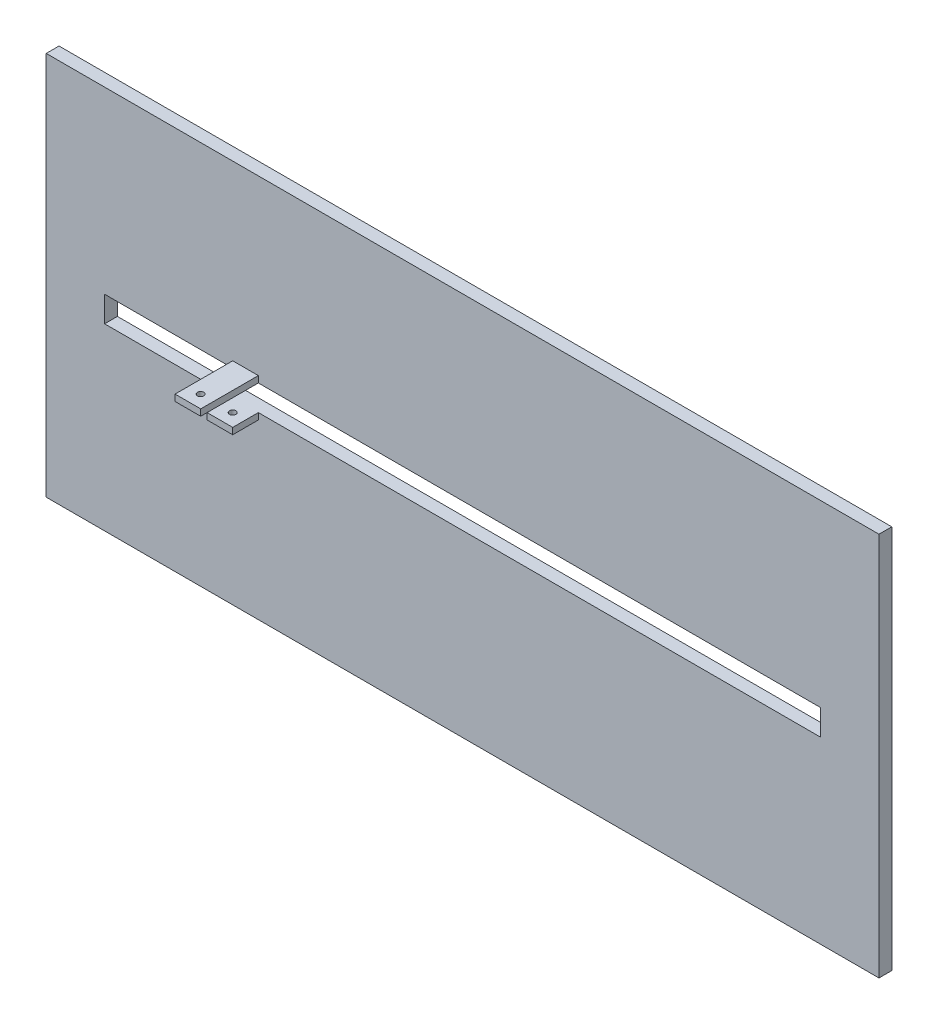
ISO-10303-21;
HEADER;
FILE_DESCRIPTION(('STEP AP214'),'2;1');
FILE_NAME('part.step','',(''),(''),'','','');
FILE_SCHEMA(('AUTOMOTIVE_DESIGN { 1 0 10303 214 1 1 1 1 }'));
ENDSEC;
DATA;
#1=APPLICATION_CONTEXT('core data for automotive mechanical design processes');
#2=APPLICATION_PROTOCOL_DEFINITION('international standard','automotive_design',2000,#1);
#3=PRODUCT_CONTEXT('',#1,'mechanical');
#4=PRODUCT('Part','Part','',(#3));
#5=PRODUCT_RELATED_PRODUCT_CATEGORY('part','',(#4));
#6=PRODUCT_DEFINITION_FORMATION('','',#4);
#7=PRODUCT_DEFINITION_CONTEXT('part definition',#1,'design');
#8=PRODUCT_DEFINITION('design','',#6,#7);
#9=PRODUCT_DEFINITION_SHAPE('','',#8);
#10=(LENGTH_UNIT() NAMED_UNIT(*) SI_UNIT(.MILLI.,.METRE.));
#11=(NAMED_UNIT(*) PLANE_ANGLE_UNIT() SI_UNIT($,.RADIAN.));
#12=(NAMED_UNIT(*) SI_UNIT($,.STERADIAN.) SOLID_ANGLE_UNIT());
#13=UNCERTAINTY_MEASURE_WITH_UNIT(LENGTH_MEASURE(1.E-05),#10,'distance_accuracy_value','');
#14=(GEOMETRIC_REPRESENTATION_CONTEXT(3) GLOBAL_UNCERTAINTY_ASSIGNED_CONTEXT((#13)) GLOBAL_UNIT_ASSIGNED_CONTEXT((#10,
#11,#12)) REPRESENTATION_CONTEXT('',''));
#15=CARTESIAN_POINT('',(0.,0.,0.));
#16=DIRECTION('',(0.,0.,1.));
#17=DIRECTION('',(1.,0.,0.));
#18=AXIS2_PLACEMENT_3D('',#15,#16,#17);
#19=CARTESIAN_POINT('',(0.,0.,20.));
#20=DIRECTION('',(0.,0.,1.));
#21=DIRECTION('',(1.,0.,0.));
#22=AXIS2_PLACEMENT_3D('',#19,#20,#21);
#23=PLANE('',#22);
#24=DIRECTION('',(0.,1.,0.));
#25=VECTOR('',#24,1.);
#26=CARTESIAN_POINT('',(649.999999999999,300.,20.));
#27=LINE('',#26,#25);
#28=CARTESIAN_POINT('',(650.,-300.,20.));
#29=VERTEX_POINT('',#28);
#30=CARTESIAN_POINT('',(649.999999999999,300.,20.));
#31=VERTEX_POINT('',#30);
#32=EDGE_CURVE('E301',#29,#31,#27,.T.);
#33=ORIENTED_EDGE('',*,*,#32,.T.);
#34=DIRECTION('',(-1.,0.,0.));
#35=VECTOR('',#34,1.);
#36=CARTESIAN_POINT('',(-650.,300.,20.));
#37=LINE('',#36,#35);
#38=CARTESIAN_POINT('',(-650.,300.,20.));
#39=VERTEX_POINT('',#38);
#40=EDGE_CURVE('E305',#31,#39,#37,.T.);
#41=ORIENTED_EDGE('',*,*,#40,.T.);
#42=DIRECTION('',(0.,-1.,0.));
#43=VECTOR('',#42,1.);
#44=CARTESIAN_POINT('',(-650.,300.,20.));
#45=LINE('',#44,#43);
#46=CARTESIAN_POINT('',(-650.,-300.,20.));
#47=VERTEX_POINT('',#46);
#48=EDGE_CURVE('E309',#39,#47,#45,.T.);
#49=ORIENTED_EDGE('',*,*,#48,.T.);
#50=DIRECTION('',(1.,0.,0.));
#51=VECTOR('',#50,1.);
#52=CARTESIAN_POINT('',(-650.,-300.,20.));
#53=LINE('',#52,#51);
#54=EDGE_CURVE('E312',#47,#29,#53,.T.);
#55=ORIENTED_EDGE('',*,*,#54,.T.);
#56=EDGE_LOOP('',(#33,#41,#49,#55));
#57=FACE_BOUND('',#56,.T.);
#58=DIRECTION('',(1.,0.,0.));
#59=VECTOR('',#58,1.);
#60=CARTESIAN_POINT('',(-558.838186436975,-20.0000000000002,20.));
#61=LINE('',#60,#59);
#62=CARTESIAN_POINT('',(-318.838186436974,-20.0000000000002,20.));
#63=VERTEX_POINT('',#62);
#64=CARTESIAN_POINT('',(558.838186436974,-20.0000000000002,20.));
#65=VERTEX_POINT('',#64);
#66=EDGE_CURVE('E258',#63,#65,#61,.T.);
#67=ORIENTED_EDGE('',*,*,#66,.F.);
#68=DIRECTION('',(0.,1.,0.));
#69=VECTOR('',#68,1.);
#70=CARTESIAN_POINT('',(-318.838186436974,-29.9999999999989,20.));
#71=LINE('',#70,#69);
#72=CARTESIAN_POINT('',(-318.838186436974,-29.9999999999989,20.));
#73=VERTEX_POINT('',#72);
#74=EDGE_CURVE('E221',#73,#63,#71,.T.);
#75=ORIENTED_EDGE('',*,*,#74,.F.);
#76=DIRECTION('',(1.,0.,0.));
#77=VECTOR('',#76,1.);
#78=CARTESIAN_POINT('',(-358.838186436974,-29.9999999999992,20.));
#79=LINE('',#78,#77);
#80=CARTESIAN_POINT('',(-358.838186436974,-29.9999999999992,20.));
#81=VERTEX_POINT('',#80);
#82=EDGE_CURVE('E199',#81,#73,#79,.T.);
#83=ORIENTED_EDGE('',*,*,#82,.F.);
#84=DIRECTION('',(0.,-1.,0.));
#85=VECTOR('',#84,1.);
#86=CARTESIAN_POINT('',(-358.838186436974,-19.9999999999992,20.));
#87=LINE('',#86,#85);
#88=CARTESIAN_POINT('',(-358.838186436974,-19.9999999999992,20.));
#89=VERTEX_POINT('',#88);
#90=EDGE_CURVE('E208',#89,#81,#87,.T.);
#91=ORIENTED_EDGE('',*,*,#90,.F.);
#92=CARTESIAN_POINT('',(-558.838186436975,-20.0000000000002,20.));
#93=VERTEX_POINT('',#92);
#94=EDGE_CURVE('E260',#93,#89,#61,.T.);
#95=ORIENTED_EDGE('',*,*,#94,.F.);
#96=DIRECTION('',(0.,-1.,0.));
#97=VECTOR('',#96,1.);
#98=CARTESIAN_POINT('',(-558.838186436975,20.,20.));
#99=LINE('',#98,#97);
#100=CARTESIAN_POINT('',(-558.838186436975,20.,20.));
#101=VERTEX_POINT('',#100);
#102=EDGE_CURVE('E255',#101,#93,#99,.T.);
#103=ORIENTED_EDGE('',*,*,#102,.F.);
#104=DIRECTION('',(-1.,0.,0.));
#105=VECTOR('',#104,1.);
#106=CARTESIAN_POINT('',(558.838186436974,20.,20.));
#107=LINE('',#106,#105);
#108=CARTESIAN_POINT('',(-358.838186436975,20.,20.));
#109=VERTEX_POINT('',#108);
#110=EDGE_CURVE('E268',#109,#101,#107,.T.);
#111=ORIENTED_EDGE('',*,*,#110,.F.);
#112=DIRECTION('',(0.,-1.,0.));
#113=VECTOR('',#112,1.);
#114=CARTESIAN_POINT('',(-358.838186436974,20.,20.));
#115=LINE('',#114,#113);
#116=CARTESIAN_POINT('',(-358.838186436974,30.,20.));
#117=VERTEX_POINT('',#116);
#118=EDGE_CURVE('E63',#117,#109,#115,.T.);
#119=ORIENTED_EDGE('',*,*,#118,.F.);
#120=DIRECTION('',(-1.,0.,0.));
#121=VECTOR('',#120,1.);
#122=CARTESIAN_POINT('',(-358.838186436974,30.,20.));
#123=LINE('',#122,#121);
#124=CARTESIAN_POINT('',(-318.838186436974,30.,20.));
#125=VERTEX_POINT('',#124);
#126=EDGE_CURVE('E241',#125,#117,#123,.T.);
#127=ORIENTED_EDGE('',*,*,#126,.F.);
#128=DIRECTION('',(0.,1.,0.));
#129=VECTOR('',#128,1.);
#130=CARTESIAN_POINT('',(-318.838186436974,30.,20.));
#131=LINE('',#130,#129);
#132=CARTESIAN_POINT('',(-318.838186436974,20.,20.));
#133=VERTEX_POINT('',#132);
#134=EDGE_CURVE('E237',#133,#125,#131,.T.);
#135=ORIENTED_EDGE('',*,*,#134,.F.);
#136=CARTESIAN_POINT('',(558.838186436974,20.,20.));
#137=VERTEX_POINT('',#136);
#138=EDGE_CURVE('E269',#137,#133,#107,.T.);
#139=ORIENTED_EDGE('',*,*,#138,.F.);
#140=DIRECTION('',(0.,1.,0.));
#141=VECTOR('',#140,1.);
#142=CARTESIAN_POINT('',(558.838186436974,20.,20.));
#143=LINE('',#142,#141);
#144=EDGE_CURVE('E264',#65,#137,#143,.T.);
#145=ORIENTED_EDGE('',*,*,#144,.F.);
#146=EDGE_LOOP('',(#67,#75,#83,#91,#95,#103,#111,#119,#127,#135,#139,#145));
#147=FACE_BOUND('',#146,.T.);
#148=ADVANCED_FACE('F39',(#57,#147),#23,.T.);
#149=CARTESIAN_POINT('',(0.,0.,0.));
#150=DIRECTION('',(0.,0.,1.));
#151=DIRECTION('',(1.,0.,0.));
#152=AXIS2_PLACEMENT_3D('',#149,#150,#151);
#153=PLANE('',#152);
#154=DIRECTION('',(0.,1.,0.));
#155=VECTOR('',#154,1.);
#156=CARTESIAN_POINT('',(649.999999999999,300.,0.));
#157=LINE('',#156,#155);
#158=CARTESIAN_POINT('',(650.,-300.,0.));
#159=VERTEX_POINT('',#158);
#160=CARTESIAN_POINT('',(649.999999999999,300.,0.));
#161=VERTEX_POINT('',#160);
#162=EDGE_CURVE('E300',#159,#161,#157,.T.);
#163=ORIENTED_EDGE('',*,*,#162,.F.);
#164=DIRECTION('',(1.,0.,0.));
#165=VECTOR('',#164,1.);
#166=CARTESIAN_POINT('',(-650.,-300.,0.));
#167=LINE('',#166,#165);
#168=CARTESIAN_POINT('',(-650.,-300.,0.));
#169=VERTEX_POINT('',#168);
#170=EDGE_CURVE('E306',#169,#159,#167,.T.);
#171=ORIENTED_EDGE('',*,*,#170,.F.);
#172=DIRECTION('',(0.,-1.,0.));
#173=VECTOR('',#172,1.);
#174=CARTESIAN_POINT('',(-650.,300.,0.));
#175=LINE('',#174,#173);
#176=CARTESIAN_POINT('',(-650.,300.,0.));
#177=VERTEX_POINT('',#176);
#178=EDGE_CURVE('E322',#177,#169,#175,.T.);
#179=ORIENTED_EDGE('',*,*,#178,.F.);
#180=DIRECTION('',(-1.,0.,0.));
#181=VECTOR('',#180,1.);
#182=CARTESIAN_POINT('',(-650.,300.,0.));
#183=LINE('',#182,#181);
#184=EDGE_CURVE('E319',#161,#177,#183,.T.);
#185=ORIENTED_EDGE('',*,*,#184,.F.);
#186=EDGE_LOOP('',(#163,#171,#179,#185));
#187=FACE_BOUND('',#186,.T.);
#188=DIRECTION('',(0.,-1.,0.));
#189=VECTOR('',#188,1.);
#190=CARTESIAN_POINT('',(-558.838186436975,20.,0.));
#191=LINE('',#190,#189);
#192=CARTESIAN_POINT('',(-558.838186436975,20.,0.));
#193=VERTEX_POINT('',#192);
#194=CARTESIAN_POINT('',(-558.838186436975,-20.0000000000002,0.));
#195=VERTEX_POINT('',#194);
#196=EDGE_CURVE('E254',#193,#195,#191,.T.);
#197=ORIENTED_EDGE('',*,*,#196,.T.);
#198=DIRECTION('',(1.,0.,0.));
#199=VECTOR('',#198,1.);
#200=CARTESIAN_POINT('',(-558.838186436975,-20.0000000000002,0.));
#201=LINE('',#200,#199);
#202=CARTESIAN_POINT('',(558.838186436974,-20.0000000000002,0.));
#203=VERTEX_POINT('',#202);
#204=EDGE_CURVE('E276',#195,#203,#201,.T.);
#205=ORIENTED_EDGE('',*,*,#204,.T.);
#206=DIRECTION('',(0.,1.,0.));
#207=VECTOR('',#206,1.);
#208=CARTESIAN_POINT('',(558.838186436974,20.,0.));
#209=LINE('',#208,#207);
#210=CARTESIAN_POINT('',(558.838186436974,20.,0.));
#211=VERTEX_POINT('',#210);
#212=EDGE_CURVE('E280',#203,#211,#209,.T.);
#213=ORIENTED_EDGE('',*,*,#212,.T.);
#214=DIRECTION('',(-1.,0.,0.));
#215=VECTOR('',#214,1.);
#216=CARTESIAN_POINT('',(558.838186436974,20.,0.));
#217=LINE('',#216,#215);
#218=EDGE_CURVE('E259',#211,#193,#217,.T.);
#219=ORIENTED_EDGE('',*,*,#218,.T.);
#220=EDGE_LOOP('',(#197,#205,#213,#219));
#221=FACE_BOUND('',#220,.T.);
#222=ADVANCED_FACE('F345',(#187,#221),#153,.F.);
#223=CARTESIAN_POINT('',(649.999999999999,300.,20.));
#224=DIRECTION('',(-1.,0.,0.));
#225=DIRECTION('',(0.,-1.,0.));
#226=AXIS2_PLACEMENT_3D('',#223,#224,#225);
#227=PLANE('',#226);
#228=ORIENTED_EDGE('',*,*,#162,.T.);
#229=DIRECTION('',(0.,0.,-1.));
#230=VECTOR('',#229,1.);
#231=CARTESIAN_POINT('',(649.999999999999,300.,20.));
#232=LINE('',#231,#230);
#233=EDGE_CURVE('E11',#31,#161,#232,.T.);
#234=ORIENTED_EDGE('',*,*,#233,.F.);
#235=ORIENTED_EDGE('',*,*,#32,.F.);
#236=DIRECTION('',(0.,0.,-1.));
#237=VECTOR('',#236,1.);
#238=CARTESIAN_POINT('',(650.,-300.,20.));
#239=LINE('',#238,#237);
#240=EDGE_CURVE('E315',#29,#159,#239,.T.);
#241=ORIENTED_EDGE('',*,*,#240,.T.);
#242=EDGE_LOOP('',(#228,#234,#235,#241));
#243=FACE_BOUND('',#242,.T.);
#244=ADVANCED_FACE('F41',(#243),#227,.F.);
#245=CARTESIAN_POINT('',(-650.,300.,20.));
#246=DIRECTION('',(0.,-1.,0.));
#247=DIRECTION('',(0.,0.,-1.));
#248=AXIS2_PLACEMENT_3D('',#245,#246,#247);
#249=PLANE('',#248);
#250=ORIENTED_EDGE('',*,*,#184,.T.);
#251=DIRECTION('',(0.,0.,-1.));
#252=VECTOR('',#251,1.);
#253=CARTESIAN_POINT('',(-650.,300.,20.));
#254=LINE('',#253,#252);
#255=EDGE_CURVE('E48',#39,#177,#254,.T.);
#256=ORIENTED_EDGE('',*,*,#255,.F.);
#257=ORIENTED_EDGE('',*,*,#40,.F.);
#258=ORIENTED_EDGE('',*,*,#233,.T.);
#259=EDGE_LOOP('',(#250,#256,#257,#258));
#260=FACE_BOUND('',#259,.T.);
#261=ADVANCED_FACE('F355',(#260),#249,.F.);
#262=CARTESIAN_POINT('',(-650.,300.,20.));
#263=DIRECTION('',(1.,0.,0.));
#264=DIRECTION('',(0.,1.,0.));
#265=AXIS2_PLACEMENT_3D('',#262,#263,#264);
#266=PLANE('',#265);
#267=ORIENTED_EDGE('',*,*,#178,.T.);
#268=DIRECTION('',(0.,0.,-1.));
#269=VECTOR('',#268,1.);
#270=CARTESIAN_POINT('',(-650.,-300.,20.));
#271=LINE('',#270,#269);
#272=EDGE_CURVE('E330',#47,#169,#271,.T.);
#273=ORIENTED_EDGE('',*,*,#272,.F.);
#274=ORIENTED_EDGE('',*,*,#48,.F.);
#275=ORIENTED_EDGE('',*,*,#255,.T.);
#276=EDGE_LOOP('',(#267,#273,#274,#275));
#277=FACE_BOUND('',#276,.T.);
#278=ADVANCED_FACE('F339',(#277),#266,.F.);
#279=CARTESIAN_POINT('',(-650.,-300.,20.));
#280=DIRECTION('',(0.,1.,0.));
#281=DIRECTION('',(0.,0.,1.));
#282=AXIS2_PLACEMENT_3D('',#279,#280,#281);
#283=PLANE('',#282);
#284=ORIENTED_EDGE('',*,*,#170,.T.);
#285=ORIENTED_EDGE('',*,*,#240,.F.);
#286=ORIENTED_EDGE('',*,*,#54,.F.);
#287=ORIENTED_EDGE('',*,*,#272,.T.);
#288=EDGE_LOOP('',(#284,#285,#286,#287));
#289=FACE_BOUND('',#288,.T.);
#290=ADVANCED_FACE('F349',(#289),#283,.F.);
#291=CARTESIAN_POINT('',(-558.838186436975,20.,20.));
#292=DIRECTION('',(1.,0.,0.));
#293=DIRECTION('',(0.,0.,-1.));
#294=AXIS2_PLACEMENT_3D('',#291,#292,#293);
#295=PLANE('',#294);
#296=ORIENTED_EDGE('',*,*,#196,.F.);
#297=DIRECTION('',(0.,0.,-1.));
#298=VECTOR('',#297,1.);
#299=CARTESIAN_POINT('',(-558.838186436975,20.,20.));
#300=LINE('',#299,#298);
#301=EDGE_CURVE('E272',#101,#193,#300,.T.);
#302=ORIENTED_EDGE('',*,*,#301,.F.);
#303=ORIENTED_EDGE('',*,*,#102,.T.);
#304=DIRECTION('',(0.,0.,-1.));
#305=VECTOR('',#304,1.);
#306=CARTESIAN_POINT('',(-558.838186436975,-20.0000000000002,20.));
#307=LINE('',#306,#305);
#308=EDGE_CURVE('E296',#93,#195,#307,.T.);
#309=ORIENTED_EDGE('',*,*,#308,.T.);
#310=EDGE_LOOP('',(#296,#302,#303,#309));
#311=FACE_BOUND('',#310,.T.);
#312=ADVANCED_FACE('F369',(#311),#295,.T.);
#313=CARTESIAN_POINT('',(-558.838186436975,-20.0000000000002,20.));
#314=DIRECTION('',(0.,1.,0.));
#315=DIRECTION('',(0.,0.,1.));
#316=AXIS2_PLACEMENT_3D('',#313,#314,#315);
#317=PLANE('',#316);
#318=CARTESIAN_POINT('',(-338.838186436974,-19.9999999999991,40.));
#319=DIRECTION('',(0.,-1.,0.));
#320=DIRECTION('',(1.,0.,0.));
#321=AXIS2_PLACEMENT_3D('',#318,#319,#320);
#322=CIRCLE('',#321,4.99999999999999);
#323=CARTESIAN_POINT('',(-333.838186436974,-19.999999999999,40.));
#324=VERTEX_POINT('',#323);
#325=EDGE_CURVE('E195',#324,#324,#322,.T.);
#326=ORIENTED_EDGE('',*,*,#325,.T.);
#327=EDGE_LOOP('',(#326));
#328=FACE_BOUND('',#327,.T.);
#329=ORIENTED_EDGE('',*,*,#204,.F.);
#330=ORIENTED_EDGE('',*,*,#308,.F.);
#331=ORIENTED_EDGE('',*,*,#94,.T.);
#332=DIRECTION('',(0.,0.,-1.));
#333=VECTOR('',#332,1.);
#334=CARTESIAN_POINT('',(-358.838186436974,-19.9999999999992,60.));
#335=LINE('',#334,#333);
#336=CARTESIAN_POINT('',(-358.838186436974,-19.9999999999992,60.));
#337=VERTEX_POINT('',#336);
#338=EDGE_CURVE('E229',#337,#89,#335,.T.);
#339=ORIENTED_EDGE('',*,*,#338,.F.);
#340=DIRECTION('',(-1.,0.,0.));
#341=VECTOR('',#340,1.);
#342=CARTESIAN_POINT('',(-318.838186436974,-19.9999999999989,60.));
#343=LINE('',#342,#341);
#344=CARTESIAN_POINT('',(-318.838186436974,-19.9999999999989,60.));
#345=VERTEX_POINT('',#344);
#346=EDGE_CURVE('E211',#345,#337,#343,.T.);
#347=ORIENTED_EDGE('',*,*,#346,.F.);
#348=DIRECTION('',(0.,0.,-1.));
#349=VECTOR('',#348,1.);
#350=CARTESIAN_POINT('',(-318.838186436974,-19.9999999999989,60.));
#351=LINE('',#350,#349);
#352=EDGE_CURVE('E55',#345,#63,#351,.T.);
#353=ORIENTED_EDGE('',*,*,#352,.T.);
#354=ORIENTED_EDGE('',*,*,#66,.T.);
#355=DIRECTION('',(0.,0.,-1.));
#356=VECTOR('',#355,1.);
#357=CARTESIAN_POINT('',(558.838186436974,-20.0000000000002,20.));
#358=LINE('',#357,#356);
#359=EDGE_CURVE('E293',#65,#203,#358,.T.);
#360=ORIENTED_EDGE('',*,*,#359,.T.);
#361=EDGE_LOOP('',(#329,#330,#331,#339,#347,#353,#354,#360));
#362=FACE_BOUND('',#361,.T.);
#363=ADVANCED_FACE('F376',(#328,#362),#317,.T.);
#364=CARTESIAN_POINT('',(558.838186436974,20.,20.));
#365=DIRECTION('',(-1.,0.,0.));
#366=DIRECTION('',(0.,0.,1.));
#367=AXIS2_PLACEMENT_3D('',#364,#365,#366);
#368=PLANE('',#367);
#369=ORIENTED_EDGE('',*,*,#212,.F.);
#370=ORIENTED_EDGE('',*,*,#359,.F.);
#371=ORIENTED_EDGE('',*,*,#144,.T.);
#372=DIRECTION('',(0.,0.,-1.));
#373=VECTOR('',#372,1.);
#374=CARTESIAN_POINT('',(558.838186436974,20.,20.));
#375=LINE('',#374,#373);
#376=EDGE_CURVE('E290',#137,#211,#375,.T.);
#377=ORIENTED_EDGE('',*,*,#376,.T.);
#378=EDGE_LOOP('',(#369,#370,#371,#377));
#379=FACE_BOUND('',#378,.T.);
#380=ADVANCED_FACE('F381',(#379),#368,.T.);
#381=CARTESIAN_POINT('',(558.838186436974,20.,20.));
#382=DIRECTION('',(0.,-1.,0.));
#383=DIRECTION('',(0.,0.,-1.));
#384=AXIS2_PLACEMENT_3D('',#381,#382,#383);
#385=PLANE('',#384);
#386=CARTESIAN_POINT('',(-338.838186436975,20.,90.));
#387=DIRECTION('',(0.,-1.,0.));
#388=DIRECTION('',(0.,0.,-1.));
#389=AXIS2_PLACEMENT_3D('',#386,#387,#388);
#390=CIRCLE('',#389,4.99999999999999);
#391=CARTESIAN_POINT('',(-338.838186436975,20.,85.));
#392=VERTEX_POINT('',#391);
#393=EDGE_CURVE('E186',#392,#392,#390,.T.);
#394=ORIENTED_EDGE('',*,*,#393,.F.);
#395=EDGE_LOOP('',(#394));
#396=FACE_BOUND('',#395,.T.);
#397=ORIENTED_EDGE('',*,*,#218,.F.);
#398=ORIENTED_EDGE('',*,*,#376,.F.);
#399=ORIENTED_EDGE('',*,*,#138,.T.);
#400=DIRECTION('',(0.,0.,-1.));
#401=VECTOR('',#400,1.);
#402=CARTESIAN_POINT('',(-318.838186436974,20.,60.));
#403=LINE('',#402,#401);
#404=CARTESIAN_POINT('',(-318.838186436974,20.,110.));
#405=VERTEX_POINT('',#404);
#406=EDGE_CURVE('E170',#405,#133,#403,.T.);
#407=ORIENTED_EDGE('',*,*,#406,.F.);
#408=DIRECTION('',(1.,0.,0.));
#409=VECTOR('',#408,1.);
#410=CARTESIAN_POINT('',(-318.838186436974,20.,110.));
#411=LINE('',#410,#409);
#412=CARTESIAN_POINT('',(-358.838186436974,20.,110.));
#413=VERTEX_POINT('',#412);
#414=EDGE_CURVE('E165',#413,#405,#411,.T.);
#415=ORIENTED_EDGE('',*,*,#414,.F.);
#416=DIRECTION('',(0.,0.,-1.));
#417=VECTOR('',#416,1.);
#418=CARTESIAN_POINT('',(-358.838186436974,20.,60.));
#419=LINE('',#418,#417);
#420=EDGE_CURVE('E154',#413,#109,#419,.T.);
#421=ORIENTED_EDGE('',*,*,#420,.T.);
#422=ORIENTED_EDGE('',*,*,#110,.T.);
#423=ORIENTED_EDGE('',*,*,#301,.T.);
#424=EDGE_LOOP('',(#397,#398,#399,#407,#415,#421,#422,#423));
#425=FACE_BOUND('',#424,.T.);
#426=ADVANCED_FACE('F167',(#396,#425),#385,.T.);
#427=CARTESIAN_POINT('',(-318.838186436974,30.,60.));
#428=DIRECTION('',(-1.,0.,0.));
#429=DIRECTION('',(0.,0.,1.));
#430=AXIS2_PLACEMENT_3D('',#427,#428,#429);
#431=PLANE('',#430);
#432=ORIENTED_EDGE('',*,*,#134,.T.);
#433=DIRECTION('',(0.,0.,-1.));
#434=VECTOR('',#433,1.);
#435=CARTESIAN_POINT('',(-318.838186436974,30.,60.));
#436=LINE('',#435,#434);
#437=CARTESIAN_POINT('',(-318.838186436974,30.,110.));
#438=VERTEX_POINT('',#437);
#439=EDGE_CURVE('E248',#438,#125,#436,.T.);
#440=ORIENTED_EDGE('',*,*,#439,.F.);
#441=DIRECTION('',(0.,1.,0.));
#442=VECTOR('',#441,1.);
#443=CARTESIAN_POINT('',(-318.838186436974,30.,110.));
#444=LINE('',#443,#442);
#445=EDGE_CURVE('E175',#405,#438,#444,.T.);
#446=ORIENTED_EDGE('',*,*,#445,.F.);
#447=ORIENTED_EDGE('',*,*,#406,.T.);
#448=EDGE_LOOP('',(#432,#440,#446,#447));
#449=FACE_BOUND('',#448,.T.);
#450=ADVANCED_FACE('F392',(#449),#431,.F.);
#451=CARTESIAN_POINT('',(-358.838186436974,30.,60.));
#452=DIRECTION('',(0.,-1.,0.));
#453=DIRECTION('',(0.,0.,-1.));
#454=AXIS2_PLACEMENT_3D('',#451,#452,#453);
#455=PLANE('',#454);
#456=CARTESIAN_POINT('',(-338.838186436975,30.,90.));
#457=DIRECTION('',(0.,-1.,0.));
#458=DIRECTION('',(0.,0.,-1.));
#459=AXIS2_PLACEMENT_3D('',#456,#457,#458);
#460=CIRCLE('',#459,4.99999999999999);
#461=CARTESIAN_POINT('',(-338.838186436975,30.,85.));
#462=VERTEX_POINT('',#461);
#463=EDGE_CURVE('E182',#462,#462,#460,.T.);
#464=ORIENTED_EDGE('',*,*,#463,.T.);
#465=EDGE_LOOP('',(#464));
#466=FACE_BOUND('',#465,.T.);
#467=ORIENTED_EDGE('',*,*,#126,.T.);
#468=DIRECTION('',(0.,0.,-1.));
#469=VECTOR('',#468,1.);
#470=CARTESIAN_POINT('',(-358.838186436974,30.,60.));
#471=LINE('',#470,#469);
#472=CARTESIAN_POINT('',(-358.838186436974,30.,110.));
#473=VERTEX_POINT('',#472);
#474=EDGE_CURVE('E162',#473,#117,#471,.T.);
#475=ORIENTED_EDGE('',*,*,#474,.F.);
#476=DIRECTION('',(-1.,0.,0.));
#477=VECTOR('',#476,1.);
#478=CARTESIAN_POINT('',(-358.838186436974,30.,110.));
#479=LINE('',#478,#477);
#480=EDGE_CURVE('E180',#438,#473,#479,.T.);
#481=ORIENTED_EDGE('',*,*,#480,.F.);
#482=ORIENTED_EDGE('',*,*,#439,.T.);
#483=EDGE_LOOP('',(#467,#475,#481,#482));
#484=FACE_BOUND('',#483,.T.);
#485=ADVANCED_FACE('F394',(#466,#484),#455,.F.);
#486=CARTESIAN_POINT('',(-358.838186436974,20.,60.));
#487=DIRECTION('',(1.,0.,0.));
#488=DIRECTION('',(0.,0.,-1.));
#489=AXIS2_PLACEMENT_3D('',#486,#487,#488);
#490=PLANE('',#489);
#491=ORIENTED_EDGE('',*,*,#118,.T.);
#492=ORIENTED_EDGE('',*,*,#420,.F.);
#493=DIRECTION('',(0.,-1.,0.));
#494=VECTOR('',#493,1.);
#495=CARTESIAN_POINT('',(-358.838186436974,20.,110.));
#496=LINE('',#495,#494);
#497=EDGE_CURVE('E159',#473,#413,#496,.T.);
#498=ORIENTED_EDGE('',*,*,#497,.F.);
#499=ORIENTED_EDGE('',*,*,#474,.T.);
#500=EDGE_LOOP('',(#491,#492,#498,#499));
#501=FACE_BOUND('',#500,.T.);
#502=ADVANCED_FACE('F156',(#501),#490,.F.);
#503=CARTESIAN_POINT('',(-358.838186436974,-29.9999999999992,60.));
#504=DIRECTION('',(0.,1.,0.));
#505=DIRECTION('',(-1.,0.,0.));
#506=AXIS2_PLACEMENT_3D('',#503,#504,#505);
#507=PLANE('',#506);
#508=CARTESIAN_POINT('',(-338.838186436974,-29.9999999999991,40.));
#509=DIRECTION('',(0.,-1.,0.));
#510=DIRECTION('',(1.,0.,0.));
#511=AXIS2_PLACEMENT_3D('',#508,#509,#510);
#512=CIRCLE('',#511,4.99999999999999);
#513=CARTESIAN_POINT('',(-333.838186436974,-29.999999999999,40.));
#514=VERTEX_POINT('',#513);
#515=EDGE_CURVE('E194',#514,#514,#512,.T.);
#516=ORIENTED_EDGE('',*,*,#515,.F.);
#517=EDGE_LOOP('',(#516));
#518=FACE_BOUND('',#517,.T.);
#519=ORIENTED_EDGE('',*,*,#82,.T.);
#520=DIRECTION('',(0.,0.,-1.));
#521=VECTOR('',#520,1.);
#522=CARTESIAN_POINT('',(-318.838186436974,-29.9999999999989,60.));
#523=LINE('',#522,#521);
#524=CARTESIAN_POINT('',(-318.838186436974,-29.9999999999989,60.));
#525=VERTEX_POINT('',#524);
#526=EDGE_CURVE('E234',#525,#73,#523,.T.);
#527=ORIENTED_EDGE('',*,*,#526,.F.);
#528=DIRECTION('',(1.,0.,0.));
#529=VECTOR('',#528,1.);
#530=CARTESIAN_POINT('',(-358.838186436974,-29.9999999999992,60.));
#531=LINE('',#530,#529);
#532=CARTESIAN_POINT('',(-358.838186436974,-29.9999999999992,60.));
#533=VERTEX_POINT('',#532);
#534=EDGE_CURVE('E203',#533,#525,#531,.T.);
#535=ORIENTED_EDGE('',*,*,#534,.F.);
#536=DIRECTION('',(0.,0.,-1.));
#537=VECTOR('',#536,1.);
#538=CARTESIAN_POINT('',(-358.838186436974,-29.9999999999992,60.));
#539=LINE('',#538,#537);
#540=EDGE_CURVE('E217',#533,#81,#539,.T.);
#541=ORIENTED_EDGE('',*,*,#540,.T.);
#542=EDGE_LOOP('',(#519,#527,#535,#541));
#543=FACE_BOUND('',#542,.T.);
#544=ADVANCED_FACE('F409',(#518,#543),#507,.F.);
#545=CARTESIAN_POINT('',(-318.838186436974,-29.9999999999989,60.));
#546=DIRECTION('',(-1.,0.,0.));
#547=DIRECTION('',(0.,-1.,0.));
#548=AXIS2_PLACEMENT_3D('',#545,#546,#547);
#549=PLANE('',#548);
#550=ORIENTED_EDGE('',*,*,#74,.T.);
#551=ORIENTED_EDGE('',*,*,#352,.F.);
#552=DIRECTION('',(0.,1.,0.));
#553=VECTOR('',#552,1.);
#554=CARTESIAN_POINT('',(-318.838186436974,-29.9999999999989,60.));
#555=LINE('',#554,#553);
#556=EDGE_CURVE('E207',#525,#345,#555,.T.);
#557=ORIENTED_EDGE('',*,*,#556,.F.);
#558=ORIENTED_EDGE('',*,*,#526,.T.);
#559=EDGE_LOOP('',(#550,#551,#557,#558));
#560=FACE_BOUND('',#559,.T.);
#561=ADVANCED_FACE('F414',(#560),#549,.F.);
#562=CARTESIAN_POINT('',(-358.838186436974,-19.9999999999992,60.));
#563=DIRECTION('',(1.,0.,0.));
#564=DIRECTION('',(0.,1.,0.));
#565=AXIS2_PLACEMENT_3D('',#562,#563,#564);
#566=PLANE('',#565);
#567=ORIENTED_EDGE('',*,*,#90,.T.);
#568=ORIENTED_EDGE('',*,*,#540,.F.);
#569=DIRECTION('',(0.,-1.,0.));
#570=VECTOR('',#569,1.);
#571=CARTESIAN_POINT('',(-358.838186436974,-19.9999999999992,60.));
#572=LINE('',#571,#570);
#573=EDGE_CURVE('E214',#337,#533,#572,.T.);
#574=ORIENTED_EDGE('',*,*,#573,.F.);
#575=ORIENTED_EDGE('',*,*,#338,.T.);
#576=EDGE_LOOP('',(#567,#568,#574,#575));
#577=FACE_BOUND('',#576,.T.);
#578=ADVANCED_FACE('F405',(#577),#566,.F.);
#579=CARTESIAN_POINT('',(0.,0.,60.));
#580=DIRECTION('',(0.,0.,1.));
#581=DIRECTION('',(1.,0.,0.));
#582=AXIS2_PLACEMENT_3D('',#579,#580,#581);
#583=PLANE('',#582);
#584=ORIENTED_EDGE('',*,*,#534,.T.);
#585=ORIENTED_EDGE('',*,*,#556,.T.);
#586=ORIENTED_EDGE('',*,*,#346,.T.);
#587=ORIENTED_EDGE('',*,*,#573,.T.);
#588=EDGE_LOOP('',(#584,#585,#586,#587));
#589=FACE_BOUND('',#588,.T.);
#590=ADVANCED_FACE('F412',(#589),#583,.T.);
#591=CARTESIAN_POINT('',(-338.838186436974,-19.9999999999991,40.));
#592=DIRECTION('',(0.,-1.,0.));
#593=DIRECTION('',(1.,0.,0.));
#594=AXIS2_PLACEMENT_3D('',#591,#592,#593);
#595=CYLINDRICAL_SURFACE('',#594,4.99999999999999);
#596=ORIENTED_EDGE('',*,*,#325,.F.);
#597=EDGE_LOOP('',(#596));
#598=FACE_BOUND('',#597,.T.);
#599=ORIENTED_EDGE('',*,*,#515,.T.);
#600=EDGE_LOOP('',(#599));
#601=FACE_BOUND('',#600,.T.);
#602=ADVANCED_FACE('F473',(#598,#601),#595,.F.);
#603=CARTESIAN_POINT('',(0.,0.,110.));
#604=DIRECTION('',(0.,0.,-1.));
#605=DIRECTION('',(-1.,0.,0.));
#606=AXIS2_PLACEMENT_3D('',#603,#604,#605);
#607=PLANE('',#606);
#608=ORIENTED_EDGE('',*,*,#497,.T.);
#609=ORIENTED_EDGE('',*,*,#414,.T.);
#610=ORIENTED_EDGE('',*,*,#445,.T.);
#611=ORIENTED_EDGE('',*,*,#480,.T.);
#612=EDGE_LOOP('',(#608,#609,#610,#611));
#613=FACE_BOUND('',#612,.T.);
#614=ADVANCED_FACE('F178',(#613),#607,.F.);
#615=CARTESIAN_POINT('',(-338.838186436975,30.,90.));
#616=DIRECTION('',(0.,-1.,0.));
#617=DIRECTION('',(0.,0.,-1.));
#618=AXIS2_PLACEMENT_3D('',#615,#616,#617);
#619=CYLINDRICAL_SURFACE('',#618,4.99999999999999);
#620=ORIENTED_EDGE('',*,*,#463,.F.);
#621=EDGE_LOOP('',(#620));
#622=FACE_BOUND('',#621,.T.);
#623=ORIENTED_EDGE('',*,*,#393,.T.);
#624=EDGE_LOOP('',(#623));
#625=FACE_BOUND('',#624,.T.);
#626=ADVANCED_FACE('F488',(#622,#625),#619,.F.);
#627=CLOSED_SHELL('',(#148,#222,#244,#261,#278,#290,#312,#363,#380,#426,#450,#485,#502,#544,
#561,#578,#590,#602,#614,#626));
#628=MANIFOLD_SOLID_BREP('B2',#627);
#629=ADVANCED_BREP_SHAPE_REPRESENTATION('',(#18,#628),#14);
#630=SHAPE_DEFINITION_REPRESENTATION(#9,#629);
ENDSEC;
END-ISO-10303-21;
